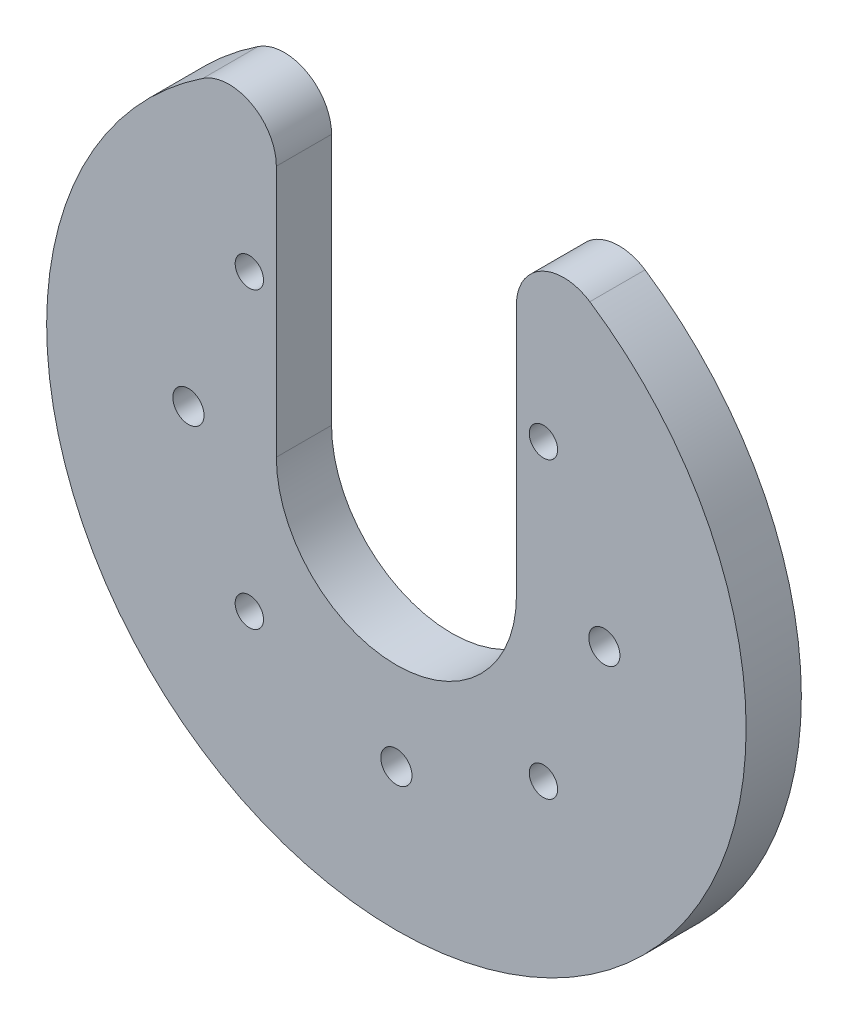
ISO-10303-21;
HEADER;
FILE_DESCRIPTION(('STEP AP214'),'2;1');
FILE_NAME('part.step','',(''),(''),'','','');
FILE_SCHEMA(('AUTOMOTIVE_DESIGN { 1 0 10303 214 1 1 1 1 }'));
ENDSEC;
DATA;
#1=APPLICATION_CONTEXT('core data for automotive mechanical design processes');
#2=APPLICATION_PROTOCOL_DEFINITION('international standard','automotive_design',2000,#1);
#3=PRODUCT_CONTEXT('',#1,'mechanical');
#4=PRODUCT('Part','Part','',(#3));
#5=PRODUCT_RELATED_PRODUCT_CATEGORY('part','',(#4));
#6=PRODUCT_DEFINITION_FORMATION('','',#4);
#7=PRODUCT_DEFINITION_CONTEXT('part definition',#1,'design');
#8=PRODUCT_DEFINITION('design','',#6,#7);
#9=PRODUCT_DEFINITION_SHAPE('','',#8);
#10=(LENGTH_UNIT() NAMED_UNIT(*) SI_UNIT(.MILLI.,.METRE.));
#11=(NAMED_UNIT(*) PLANE_ANGLE_UNIT() SI_UNIT($,.RADIAN.));
#12=(NAMED_UNIT(*) SI_UNIT($,.STERADIAN.) SOLID_ANGLE_UNIT());
#13=UNCERTAINTY_MEASURE_WITH_UNIT(LENGTH_MEASURE(1.E-05),#10,'distance_accuracy_value','');
#14=(GEOMETRIC_REPRESENTATION_CONTEXT(3) GLOBAL_UNCERTAINTY_ASSIGNED_CONTEXT((#13)) GLOBAL_UNIT_ASSIGNED_CONTEXT((#10,
#11,#12)) REPRESENTATION_CONTEXT('',''));
#15=CARTESIAN_POINT('',(0.,0.,0.));
#16=DIRECTION('',(0.,0.,1.));
#17=DIRECTION('',(1.,0.,0.));
#18=AXIS2_PLACEMENT_3D('',#15,#16,#17);
#19=CARTESIAN_POINT('',(0.,0.,5.842));
#20=DIRECTION('',(0.,0.,-1.));
#21=DIRECTION('',(-1.,0.,0.));
#22=AXIS2_PLACEMENT_3D('',#19,#20,#21);
#23=CYLINDRICAL_SURFACE('',#22,12.7);
#24=CARTESIAN_POINT('',(0.,0.,0.));
#25=DIRECTION('',(0.,0.,1.));
#26=DIRECTION('',(1.,0.,0.));
#27=AXIS2_PLACEMENT_3D('',#24,#25,#26);
#28=CIRCLE('',#27,12.7);
#29=CARTESIAN_POINT('',(-12.7,0.,0.));
#30=VERTEX_POINT('',#29);
#31=CARTESIAN_POINT('',(12.7,0.,0.));
#32=VERTEX_POINT('',#31);
#33=EDGE_CURVE('E95',#30,#32,#28,.T.);
#34=ORIENTED_EDGE('',*,*,#33,.F.);
#35=DIRECTION('',(0.,0.,-1.));
#36=VECTOR('',#35,1.);
#37=CARTESIAN_POINT('',(-12.7,0.,5.842));
#38=LINE('',#37,#36);
#39=CARTESIAN_POINT('',(-12.7,0.,5.842));
#40=VERTEX_POINT('',#39);
#41=EDGE_CURVE('E90',#40,#30,#38,.T.);
#42=ORIENTED_EDGE('',*,*,#41,.F.);
#43=CARTESIAN_POINT('',(0.,0.,5.842));
#44=DIRECTION('',(0.,0.,1.));
#45=DIRECTION('',(1.,0.,0.));
#46=AXIS2_PLACEMENT_3D('',#43,#44,#45);
#47=CIRCLE('',#46,12.7);
#48=CARTESIAN_POINT('',(12.7,0.,5.842));
#49=VERTEX_POINT('',#48);
#50=EDGE_CURVE('E92',#40,#49,#47,.T.);
#51=ORIENTED_EDGE('',*,*,#50,.T.);
#52=DIRECTION('',(0.,0.,-1.));
#53=VECTOR('',#52,1.);
#54=CARTESIAN_POINT('',(12.7,0.,5.842));
#55=LINE('',#54,#53);
#56=EDGE_CURVE('E98',#49,#32,#55,.T.);
#57=ORIENTED_EDGE('',*,*,#56,.T.);
#58=EDGE_LOOP('',(#34,#42,#51,#57));
#59=FACE_BOUND('',#58,.T.);
#60=ADVANCED_FACE('F35',(#59),#23,.F.);
#61=CARTESIAN_POINT('',(-12.7,0.,5.842));
#62=DIRECTION('',(-1.,0.,0.));
#63=DIRECTION('',(0.,0.,1.));
#64=AXIS2_PLACEMENT_3D('',#61,#62,#63);
#65=PLANE('',#64);
#66=DIRECTION('',(0.,1.,0.));
#67=VECTOR('',#66,1.);
#68=CARTESIAN_POINT('',(-12.7,0.,0.));
#69=LINE('',#68,#67);
#70=CARTESIAN_POINT('',(-12.7,26.6591447724791,0.));
#71=VERTEX_POINT('',#70);
#72=EDGE_CURVE('E129',#30,#71,#69,.T.);
#73=ORIENTED_EDGE('',*,*,#72,.T.);
#74=DIRECTION('',(0.,0.,-1.));
#75=VECTOR('',#74,1.);
#76=CARTESIAN_POINT('',(-12.7,26.6591447724791,5.842));
#77=LINE('',#76,#75);
#78=CARTESIAN_POINT('',(-12.7,26.6591447724791,5.842));
#79=VERTEX_POINT('',#78);
#80=EDGE_CURVE('E11',#71,#79,#77,.F.);
#81=ORIENTED_EDGE('',*,*,#80,.T.);
#82=DIRECTION('',(0.,1.,0.));
#83=VECTOR('',#82,1.);
#84=CARTESIAN_POINT('',(-12.7,0.,5.842));
#85=LINE('',#84,#83);
#86=EDGE_CURVE('E100',#40,#79,#85,.T.);
#87=ORIENTED_EDGE('',*,*,#86,.F.);
#88=ORIENTED_EDGE('',*,*,#41,.T.);
#89=EDGE_LOOP('',(#73,#81,#87,#88));
#90=FACE_BOUND('',#89,.T.);
#91=ADVANCED_FACE('F101',(#90),#65,.F.);
#92=CARTESIAN_POINT('',(0.,0.,5.842));
#93=DIRECTION('',(0.,0.,-1.));
#94=DIRECTION('',(-1.,0.,0.));
#95=AXIS2_PLACEMENT_3D('',#92,#93,#94);
#96=CYLINDRICAL_SURFACE('',#95,37.);
#97=CARTESIAN_POINT('',(0.,0.,0.));
#98=DIRECTION('',(0.,0.,1.));
#99=DIRECTION('',(1.,0.,0.));
#100=AXIS2_PLACEMENT_3D('',#97,#98,#99);
#101=CIRCLE('',#100,37.);
#102=CARTESIAN_POINT('',(-20.465625,30.824636143179,0.));
#103=VERTEX_POINT('',#102);
#104=CARTESIAN_POINT('',(20.465625,30.824636143179,0.));
#105=VERTEX_POINT('',#104);
#106=EDGE_CURVE('E131',#103,#105,#101,.T.);
#107=ORIENTED_EDGE('',*,*,#106,.T.);
#108=DIRECTION('',(0.,0.,-1.));
#109=VECTOR('',#108,1.);
#110=CARTESIAN_POINT('',(20.465625,30.824636143179,5.842));
#111=LINE('',#110,#109);
#112=CARTESIAN_POINT('',(20.465625,30.824636143179,5.842));
#113=VERTEX_POINT('',#112);
#114=EDGE_CURVE('E56',#105,#113,#111,.F.);
#115=ORIENTED_EDGE('',*,*,#114,.T.);
#116=CARTESIAN_POINT('',(0.,0.,5.842));
#117=DIRECTION('',(0.,0.,1.));
#118=DIRECTION('',(1.,0.,0.));
#119=AXIS2_PLACEMENT_3D('',#116,#117,#118);
#120=CIRCLE('',#119,37.);
#121=CARTESIAN_POINT('',(-20.465625,30.824636143179,5.842));
#122=VERTEX_POINT('',#121);
#123=EDGE_CURVE('E104',#122,#113,#120,.T.);
#124=ORIENTED_EDGE('',*,*,#123,.F.);
#125=DIRECTION('',(0.,0.,-1.));
#126=VECTOR('',#125,1.);
#127=CARTESIAN_POINT('',(-20.465625,30.824636143179,5.842));
#128=LINE('',#127,#126);
#129=EDGE_CURVE('E144',#122,#103,#128,.T.);
#130=ORIENTED_EDGE('',*,*,#129,.T.);
#131=EDGE_LOOP('',(#107,#115,#124,#130));
#132=FACE_BOUND('',#131,.T.);
#133=ADVANCED_FACE('F159',(#132),#96,.T.);
#134=CARTESIAN_POINT('',(22.,0.,5.842));
#135=DIRECTION('',(0.,0.,-1.));
#136=DIRECTION('',(-1.,0.,0.));
#137=AXIS2_PLACEMENT_3D('',#134,#135,#136);
#138=CYLINDRICAL_SURFACE('',#137,1.65);
#139=CARTESIAN_POINT('',(22.,0.,5.842));
#140=DIRECTION('',(0.,0.,1.));
#141=DIRECTION('',(1.,0.,0.));
#142=AXIS2_PLACEMENT_3D('',#139,#140,#141);
#143=CIRCLE('',#142,1.65);
#144=CARTESIAN_POINT('',(23.65,0.,5.842));
#145=VERTEX_POINT('',#144);
#146=EDGE_CURVE('E109',#145,#145,#143,.T.);
#147=ORIENTED_EDGE('',*,*,#146,.T.);
#148=EDGE_LOOP('',(#147));
#149=FACE_BOUND('',#148,.T.);
#150=CARTESIAN_POINT('',(22.,0.,0.));
#151=DIRECTION('',(0.,0.,1.));
#152=DIRECTION('',(1.,0.,0.));
#153=AXIS2_PLACEMENT_3D('',#150,#151,#152);
#154=CIRCLE('',#153,1.65);
#155=CARTESIAN_POINT('',(23.65,0.,0.));
#156=VERTEX_POINT('',#155);
#157=EDGE_CURVE('E125',#156,#156,#154,.T.);
#158=ORIENTED_EDGE('',*,*,#157,.F.);
#159=EDGE_LOOP('',(#158));
#160=FACE_BOUND('',#159,.T.);
#161=ADVANCED_FACE('F179',(#149,#160),#138,.F.);
#162=CARTESIAN_POINT('',(0.,-22.,5.842));
#163=DIRECTION('',(0.,0.,-1.));
#164=DIRECTION('',(-1.,0.,0.));
#165=AXIS2_PLACEMENT_3D('',#162,#163,#164);
#166=CYLINDRICAL_SURFACE('',#165,1.65);
#167=CARTESIAN_POINT('',(0.,-22.,5.842));
#168=DIRECTION('',(0.,0.,1.));
#169=DIRECTION('',(1.,0.,0.));
#170=AXIS2_PLACEMENT_3D('',#167,#168,#169);
#171=CIRCLE('',#170,1.65);
#172=CARTESIAN_POINT('',(1.65,-22.,5.842));
#173=VERTEX_POINT('',#172);
#174=EDGE_CURVE('E112',#173,#173,#171,.T.);
#175=ORIENTED_EDGE('',*,*,#174,.T.);
#176=EDGE_LOOP('',(#175));
#177=FACE_BOUND('',#176,.T.);
#178=CARTESIAN_POINT('',(0.,-22.,0.));
#179=DIRECTION('',(0.,0.,1.));
#180=DIRECTION('',(1.,0.,0.));
#181=AXIS2_PLACEMENT_3D('',#178,#179,#180);
#182=CIRCLE('',#181,1.65);
#183=CARTESIAN_POINT('',(1.65,-22.,0.));
#184=VERTEX_POINT('',#183);
#185=EDGE_CURVE('E121',#184,#184,#182,.T.);
#186=ORIENTED_EDGE('',*,*,#185,.F.);
#187=EDGE_LOOP('',(#186));
#188=FACE_BOUND('',#187,.T.);
#189=ADVANCED_FACE('F182',(#177,#188),#166,.F.);
#190=CARTESIAN_POINT('',(-22.,0.,5.842));
#191=DIRECTION('',(0.,0.,-1.));
#192=DIRECTION('',(-1.,0.,0.));
#193=AXIS2_PLACEMENT_3D('',#190,#191,#192);
#194=CYLINDRICAL_SURFACE('',#193,1.65);
#195=CARTESIAN_POINT('',(-22.,0.,5.842));
#196=DIRECTION('',(0.,0.,1.));
#197=DIRECTION('',(1.,0.,0.));
#198=AXIS2_PLACEMENT_3D('',#195,#196,#197);
#199=CIRCLE('',#198,1.65);
#200=CARTESIAN_POINT('',(-20.35,0.,5.842));
#201=VERTEX_POINT('',#200);
#202=EDGE_CURVE('E136',#201,#201,#199,.T.);
#203=ORIENTED_EDGE('',*,*,#202,.T.);
#204=EDGE_LOOP('',(#203));
#205=FACE_BOUND('',#204,.T.);
#206=CARTESIAN_POINT('',(-22.,0.,0.));
#207=DIRECTION('',(0.,0.,1.));
#208=DIRECTION('',(1.,0.,0.));
#209=AXIS2_PLACEMENT_3D('',#206,#207,#208);
#210=CIRCLE('',#209,1.65);
#211=CARTESIAN_POINT('',(-20.35,0.,0.));
#212=VERTEX_POINT('',#211);
#213=EDGE_CURVE('E118',#212,#212,#210,.T.);
#214=ORIENTED_EDGE('',*,*,#213,.F.);
#215=EDGE_LOOP('',(#214));
#216=FACE_BOUND('',#215,.T.);
#217=ADVANCED_FACE('F186',(#205,#216),#194,.F.);
#218=CARTESIAN_POINT('',(12.7,0.,5.842));
#219=DIRECTION('',(-1.,0.,0.));
#220=DIRECTION('',(0.,0.,1.));
#221=AXIS2_PLACEMENT_3D('',#218,#219,#220);
#222=PLANE('',#221);
#223=DIRECTION('',(0.,1.,0.));
#224=VECTOR('',#223,1.);
#225=CARTESIAN_POINT('',(12.7,0.,5.842));
#226=LINE('',#225,#224);
#227=CARTESIAN_POINT('',(12.7,26.6591447724791,5.842));
#228=VERTEX_POINT('',#227);
#229=EDGE_CURVE('E108',#49,#228,#226,.T.);
#230=ORIENTED_EDGE('',*,*,#229,.T.);
#231=DIRECTION('',(0.,0.,1.));
#232=VECTOR('',#231,1.);
#233=CARTESIAN_POINT('',(12.7,26.6591447724791,0.));
#234=LINE('',#233,#232);
#235=CARTESIAN_POINT('',(12.7,26.6591447724791,0.));
#236=VERTEX_POINT('',#235);
#237=EDGE_CURVE('E97',#228,#236,#234,.F.);
#238=ORIENTED_EDGE('',*,*,#237,.T.);
#239=DIRECTION('',(0.,1.,0.));
#240=VECTOR('',#239,1.);
#241=CARTESIAN_POINT('',(12.7,0.,0.));
#242=LINE('',#241,#240);
#243=EDGE_CURVE('E133',#32,#236,#242,.T.);
#244=ORIENTED_EDGE('',*,*,#243,.F.);
#245=ORIENTED_EDGE('',*,*,#56,.F.);
#246=EDGE_LOOP('',(#230,#238,#244,#245));
#247=FACE_BOUND('',#246,.T.);
#248=ADVANCED_FACE('F153',(#247),#222,.T.);
#249=CARTESIAN_POINT('',(0.,0.,5.842));
#250=DIRECTION('',(0.,0.,1.));
#251=DIRECTION('',(1.,0.,0.));
#252=AXIS2_PLACEMENT_3D('',#249,#250,#251);
#253=PLANE('',#252);
#254=CARTESIAN_POINT('',(15.5563491861041,-15.556349186104,5.842));
#255=DIRECTION('',(0.,0.,1.));
#256=DIRECTION('',(1.,0.,0.));
#257=AXIS2_PLACEMENT_3D('',#254,#255,#256);
#258=CIRCLE('',#257,1.5);
#259=CARTESIAN_POINT('',(17.0563491861041,-15.556349186104,5.842));
#260=VERTEX_POINT('',#259);
#261=EDGE_CURVE('E311',#260,#260,#258,.T.);
#262=ORIENTED_EDGE('',*,*,#261,.F.);
#263=EDGE_LOOP('',(#262));
#264=FACE_BOUND('',#263,.T.);
#265=CARTESIAN_POINT('',(15.556349186104,15.5563491861041,5.842));
#266=DIRECTION('',(0.,0.,1.));
#267=DIRECTION('',(1.,0.,0.));
#268=AXIS2_PLACEMENT_3D('',#265,#266,#267);
#269=CIRCLE('',#268,1.5);
#270=CARTESIAN_POINT('',(17.056349186104,15.5563491861041,5.842));
#271=VERTEX_POINT('',#270);
#272=EDGE_CURVE('E313',#271,#271,#269,.T.);
#273=ORIENTED_EDGE('',*,*,#272,.F.);
#274=EDGE_LOOP('',(#273));
#275=FACE_BOUND('',#274,.T.);
#276=CARTESIAN_POINT('',(-15.5563491861041,15.556349186104,5.842));
#277=DIRECTION('',(0.,0.,1.));
#278=DIRECTION('',(1.,0.,0.));
#279=AXIS2_PLACEMENT_3D('',#276,#277,#278);
#280=CIRCLE('',#279,1.5);
#281=CARTESIAN_POINT('',(-14.0563491861041,15.556349186104,5.842));
#282=VERTEX_POINT('',#281);
#283=EDGE_CURVE('E319',#282,#282,#280,.T.);
#284=ORIENTED_EDGE('',*,*,#283,.F.);
#285=EDGE_LOOP('',(#284));
#286=FACE_BOUND('',#285,.T.);
#287=CARTESIAN_POINT('',(-15.556349186104,-15.5563491861041,5.842));
#288=DIRECTION('',(0.,0.,1.));
#289=DIRECTION('',(1.,0.,0.));
#290=AXIS2_PLACEMENT_3D('',#287,#288,#289);
#291=CIRCLE('',#290,1.5);
#292=CARTESIAN_POINT('',(-14.056349186104,-15.5563491861041,5.842));
#293=VERTEX_POINT('',#292);
#294=EDGE_CURVE('E325',#293,#293,#291,.T.);
#295=ORIENTED_EDGE('',*,*,#294,.F.);
#296=EDGE_LOOP('',(#295));
#297=FACE_BOUND('',#296,.T.);
#298=ORIENTED_EDGE('',*,*,#202,.F.);
#299=EDGE_LOOP('',(#298));
#300=FACE_BOUND('',#299,.T.);
#301=ORIENTED_EDGE('',*,*,#174,.F.);
#302=EDGE_LOOP('',(#301));
#303=FACE_BOUND('',#302,.T.);
#304=ORIENTED_EDGE('',*,*,#146,.F.);
#305=EDGE_LOOP('',(#304));
#306=FACE_BOUND('',#305,.T.);
#307=ORIENTED_EDGE('',*,*,#123,.T.);
#308=CARTESIAN_POINT('',(17.7,26.6591447724791,5.842));
#309=DIRECTION('',(0.,0.,1.));
#310=DIRECTION('',(1.,0.,0.));
#311=AXIS2_PLACEMENT_3D('',#308,#309,#310);
#312=CIRCLE('',#311,5.);
#313=EDGE_CURVE('E43',#113,#228,#312,.T.);
#314=ORIENTED_EDGE('',*,*,#313,.T.);
#315=ORIENTED_EDGE('',*,*,#229,.F.);
#316=ORIENTED_EDGE('',*,*,#50,.F.);
#317=ORIENTED_EDGE('',*,*,#86,.T.);
#318=CARTESIAN_POINT('',(-17.7,26.6591447724791,5.842));
#319=DIRECTION('',(0.,0.,1.));
#320=DIRECTION('',(1.,0.,0.));
#321=AXIS2_PLACEMENT_3D('',#318,#319,#320);
#322=CIRCLE('',#321,5.);
#323=EDGE_CURVE('E148',#79,#122,#322,.T.);
#324=ORIENTED_EDGE('',*,*,#323,.T.);
#325=EDGE_LOOP('',(#307,#314,#315,#316,#317,#324));
#326=FACE_BOUND('',#325,.T.);
#327=ADVANCED_FACE('F106',(#264,#275,#286,#297,#300,#303,#306,#326),#253,.T.);
#328=CARTESIAN_POINT('',(0.,0.,0.));
#329=DIRECTION('',(0.,0.,1.));
#330=DIRECTION('',(1.,0.,0.));
#331=AXIS2_PLACEMENT_3D('',#328,#329,#330);
#332=PLANE('',#331);
#333=CARTESIAN_POINT('',(15.5563491861041,-15.556349186104,0.));
#334=DIRECTION('',(0.,0.,1.));
#335=DIRECTION('',(1.,0.,0.));
#336=AXIS2_PLACEMENT_3D('',#333,#334,#335);
#337=CIRCLE('',#336,1.5);
#338=CARTESIAN_POINT('',(17.0563491861041,-15.556349186104,0.));
#339=VERTEX_POINT('',#338);
#340=EDGE_CURVE('E308',#339,#339,#337,.T.);
#341=ORIENTED_EDGE('',*,*,#340,.T.);
#342=EDGE_LOOP('',(#341));
#343=FACE_BOUND('',#342,.T.);
#344=CARTESIAN_POINT('',(15.556349186104,15.5563491861041,0.));
#345=DIRECTION('',(0.,0.,1.));
#346=DIRECTION('',(1.,0.,0.));
#347=AXIS2_PLACEMENT_3D('',#344,#345,#346);
#348=CIRCLE('',#347,1.5);
#349=CARTESIAN_POINT('',(17.056349186104,15.5563491861041,0.));
#350=VERTEX_POINT('',#349);
#351=EDGE_CURVE('E316',#350,#350,#348,.T.);
#352=ORIENTED_EDGE('',*,*,#351,.T.);
#353=EDGE_LOOP('',(#352));
#354=FACE_BOUND('',#353,.T.);
#355=CARTESIAN_POINT('',(-15.5563491861041,15.556349186104,0.));
#356=DIRECTION('',(0.,0.,1.));
#357=DIRECTION('',(1.,0.,0.));
#358=AXIS2_PLACEMENT_3D('',#355,#356,#357);
#359=CIRCLE('',#358,1.5);
#360=CARTESIAN_POINT('',(-14.0563491861041,15.556349186104,0.));
#361=VERTEX_POINT('',#360);
#362=EDGE_CURVE('E322',#361,#361,#359,.T.);
#363=ORIENTED_EDGE('',*,*,#362,.T.);
#364=EDGE_LOOP('',(#363));
#365=FACE_BOUND('',#364,.T.);
#366=CARTESIAN_POINT('',(-15.556349186104,-15.5563491861041,0.));
#367=DIRECTION('',(0.,0.,1.));
#368=DIRECTION('',(1.,0.,0.));
#369=AXIS2_PLACEMENT_3D('',#366,#367,#368);
#370=CIRCLE('',#369,1.5);
#371=CARTESIAN_POINT('',(-14.056349186104,-15.5563491861041,0.));
#372=VERTEX_POINT('',#371);
#373=EDGE_CURVE('E122',#372,#372,#370,.T.);
#374=ORIENTED_EDGE('',*,*,#373,.T.);
#375=EDGE_LOOP('',(#374));
#376=FACE_BOUND('',#375,.T.);
#377=ORIENTED_EDGE('',*,*,#213,.T.);
#378=EDGE_LOOP('',(#377));
#379=FACE_BOUND('',#378,.T.);
#380=ORIENTED_EDGE('',*,*,#185,.T.);
#381=EDGE_LOOP('',(#380));
#382=FACE_BOUND('',#381,.T.);
#383=ORIENTED_EDGE('',*,*,#157,.T.);
#384=EDGE_LOOP('',(#383));
#385=FACE_BOUND('',#384,.T.);
#386=ORIENTED_EDGE('',*,*,#243,.T.);
#387=CARTESIAN_POINT('',(17.7,26.6591447724791,0.));
#388=DIRECTION('',(0.,0.,1.));
#389=DIRECTION('',(1.,0.,0.));
#390=AXIS2_PLACEMENT_3D('',#387,#388,#389);
#391=CIRCLE('',#390,5.);
#392=EDGE_CURVE('E142',#236,#105,#391,.F.);
#393=ORIENTED_EDGE('',*,*,#392,.T.);
#394=ORIENTED_EDGE('',*,*,#106,.F.);
#395=CARTESIAN_POINT('',(-17.7,26.6591447724791,0.));
#396=DIRECTION('',(0.,0.,1.));
#397=DIRECTION('',(1.,0.,0.));
#398=AXIS2_PLACEMENT_3D('',#395,#396,#397);
#399=CIRCLE('',#398,5.);
#400=EDGE_CURVE('E140',#103,#71,#399,.F.);
#401=ORIENTED_EDGE('',*,*,#400,.T.);
#402=ORIENTED_EDGE('',*,*,#72,.F.);
#403=ORIENTED_EDGE('',*,*,#33,.T.);
#404=EDGE_LOOP('',(#386,#393,#394,#401,#402,#403));
#405=FACE_BOUND('',#404,.T.);
#406=ADVANCED_FACE('F158',(#343,#354,#365,#376,#379,#382,#385,#405),#332,.F.);
#407=CARTESIAN_POINT('',(17.7,26.6591447724791,5.842));
#408=DIRECTION('',(0.,0.,-1.));
#409=DIRECTION('',(-1.,0.,0.));
#410=AXIS2_PLACEMENT_3D('',#407,#408,#409);
#411=CYLINDRICAL_SURFACE('',#410,5.);
#412=ORIENTED_EDGE('',*,*,#313,.F.);
#413=ORIENTED_EDGE('',*,*,#114,.F.);
#414=ORIENTED_EDGE('',*,*,#392,.F.);
#415=ORIENTED_EDGE('',*,*,#237,.F.);
#416=EDGE_LOOP('',(#412,#413,#414,#415));
#417=FACE_BOUND('',#416,.T.);
#418=ADVANCED_FACE('F155',(#417),#411,.T.);
#419=CARTESIAN_POINT('',(-17.7,26.6591447724791,5.842));
#420=DIRECTION('',(0.,0.,-1.));
#421=DIRECTION('',(-1.,0.,0.));
#422=AXIS2_PLACEMENT_3D('',#419,#420,#421);
#423=CYLINDRICAL_SURFACE('',#422,5.);
#424=ORIENTED_EDGE('',*,*,#323,.F.);
#425=ORIENTED_EDGE('',*,*,#80,.F.);
#426=ORIENTED_EDGE('',*,*,#400,.F.);
#427=ORIENTED_EDGE('',*,*,#129,.F.);
#428=EDGE_LOOP('',(#424,#425,#426,#427));
#429=FACE_BOUND('',#428,.T.);
#430=ADVANCED_FACE('F37',(#429),#423,.T.);
#431=CARTESIAN_POINT('',(-15.556349186104,-15.5563491861041,0.));
#432=DIRECTION('',(0.,0.,1.));
#433=DIRECTION('',(1.,0.,0.));
#434=AXIS2_PLACEMENT_3D('',#431,#432,#433);
#435=CYLINDRICAL_SURFACE('',#434,1.5);
#436=ORIENTED_EDGE('',*,*,#373,.F.);
#437=EDGE_LOOP('',(#436));
#438=FACE_BOUND('',#437,.T.);
#439=ORIENTED_EDGE('',*,*,#294,.T.);
#440=EDGE_LOOP('',(#439));
#441=FACE_BOUND('',#440,.T.);
#442=ADVANCED_FACE('F163',(#438,#441),#435,.F.);
#443=CARTESIAN_POINT('',(-15.5563491861041,15.556349186104,0.));
#444=DIRECTION('',(0.,0.,1.));
#445=DIRECTION('',(1.,0.,0.));
#446=AXIS2_PLACEMENT_3D('',#443,#444,#445);
#447=CYLINDRICAL_SURFACE('',#446,1.5);
#448=ORIENTED_EDGE('',*,*,#362,.F.);
#449=EDGE_LOOP('',(#448));
#450=FACE_BOUND('',#449,.T.);
#451=ORIENTED_EDGE('',*,*,#283,.T.);
#452=EDGE_LOOP('',(#451));
#453=FACE_BOUND('',#452,.T.);
#454=ADVANCED_FACE('F168',(#450,#453),#447,.F.);
#455=CARTESIAN_POINT('',(15.556349186104,15.5563491861041,0.));
#456=DIRECTION('',(0.,0.,1.));
#457=DIRECTION('',(1.,0.,0.));
#458=AXIS2_PLACEMENT_3D('',#455,#456,#457);
#459=CYLINDRICAL_SURFACE('',#458,1.5);
#460=ORIENTED_EDGE('',*,*,#351,.F.);
#461=EDGE_LOOP('',(#460));
#462=FACE_BOUND('',#461,.T.);
#463=ORIENTED_EDGE('',*,*,#272,.T.);
#464=EDGE_LOOP('',(#463));
#465=FACE_BOUND('',#464,.T.);
#466=ADVANCED_FACE('F282',(#462,#465),#459,.F.);
#467=CARTESIAN_POINT('',(15.5563491861041,-15.556349186104,0.));
#468=DIRECTION('',(0.,0.,1.));
#469=DIRECTION('',(1.,0.,0.));
#470=AXIS2_PLACEMENT_3D('',#467,#468,#469);
#471=CYLINDRICAL_SURFACE('',#470,1.5);
#472=ORIENTED_EDGE('',*,*,#340,.F.);
#473=EDGE_LOOP('',(#472));
#474=FACE_BOUND('',#473,.T.);
#475=ORIENTED_EDGE('',*,*,#261,.T.);
#476=EDGE_LOOP('',(#475));
#477=FACE_BOUND('',#476,.T.);
#478=ADVANCED_FACE('F291',(#474,#477),#471,.F.);
#479=CLOSED_SHELL('',(#60,#91,#133,#161,#189,#217,#248,#327,#406,#418,#430,#442,#454,#466,#478));
#480=MANIFOLD_SOLID_BREP('B2',#479);
#481=ADVANCED_BREP_SHAPE_REPRESENTATION('',(#18,#480),#14);
#482=SHAPE_DEFINITION_REPRESENTATION(#9,#481);
ENDSEC;
END-ISO-10303-21;
